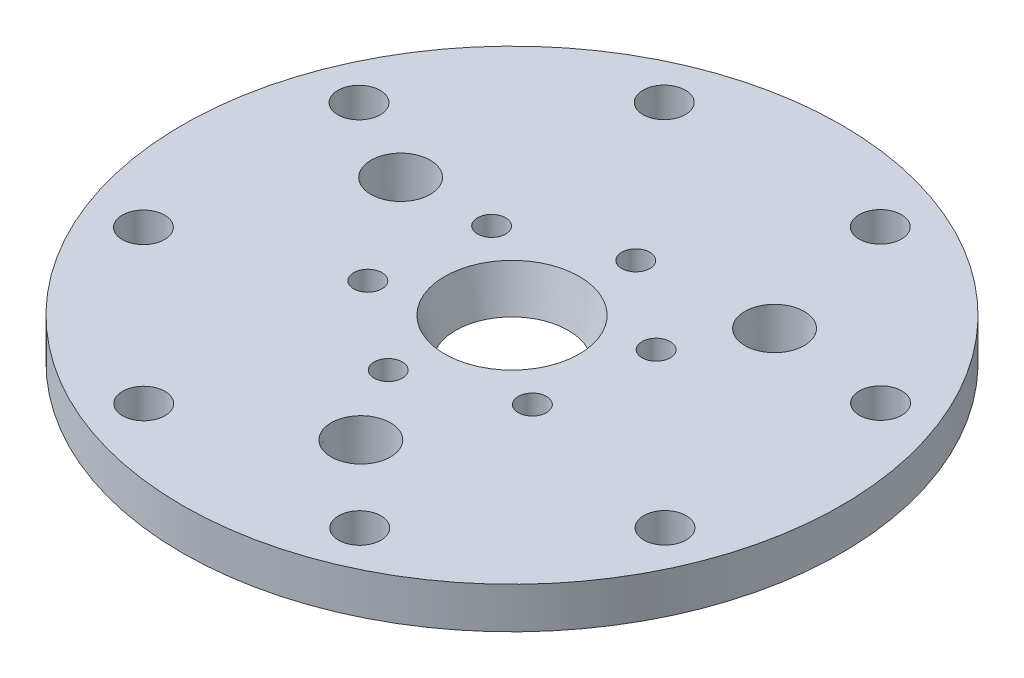
ISO-10303-21;
HEADER;
FILE_DESCRIPTION(('STEP AP214'),'2;1');
FILE_NAME('part.step','',(''),(''),'','','');
FILE_SCHEMA(('AUTOMOTIVE_DESIGN { 1 0 10303 214 1 1 1 1 }'));
ENDSEC;
DATA;
#1=APPLICATION_CONTEXT('core data for automotive mechanical design processes');
#2=APPLICATION_PROTOCOL_DEFINITION('international standard','automotive_design',2000,#1);
#3=PRODUCT_CONTEXT('',#1,'mechanical');
#4=PRODUCT('Part','Part','',(#3));
#5=PRODUCT_RELATED_PRODUCT_CATEGORY('part','',(#4));
#6=PRODUCT_DEFINITION_FORMATION('','',#4);
#7=PRODUCT_DEFINITION_CONTEXT('part definition',#1,'design');
#8=PRODUCT_DEFINITION('design','',#6,#7);
#9=PRODUCT_DEFINITION_SHAPE('','',#8);
#10=(LENGTH_UNIT() NAMED_UNIT(*) SI_UNIT(.MILLI.,.METRE.));
#11=(NAMED_UNIT(*) PLANE_ANGLE_UNIT() SI_UNIT($,.RADIAN.));
#12=(NAMED_UNIT(*) SI_UNIT($,.STERADIAN.) SOLID_ANGLE_UNIT());
#13=UNCERTAINTY_MEASURE_WITH_UNIT(LENGTH_MEASURE(1.E-05),#10,'distance_accuracy_value','');
#14=(GEOMETRIC_REPRESENTATION_CONTEXT(3) GLOBAL_UNCERTAINTY_ASSIGNED_CONTEXT((#13)) GLOBAL_UNIT_ASSIGNED_CONTEXT((#10,
#11,#12)) REPRESENTATION_CONTEXT('',''));
#15=CARTESIAN_POINT('',(0.,0.,0.));
#16=DIRECTION('',(0.,0.,1.));
#17=DIRECTION('',(1.,0.,0.));
#18=AXIS2_PLACEMENT_3D('',#15,#16,#17);
#19=CARTESIAN_POINT('',(0.,0.,0.));
#20=DIRECTION('',(0.,1.,0.));
#21=DIRECTION('',(0.,0.,1.));
#22=AXIS2_PLACEMENT_3D('',#19,#20,#21);
#23=PLANE('',#22);
#24=CARTESIAN_POINT('',(3.3300494790141,0.,-25.2942370257992));
#25=DIRECTION('',(0.,1.,0.));
#26=DIRECTION('',(0.,0.,1.));
#27=AXIS2_PLACEMENT_3D('',#24,#25,#26);
#28=CIRCLE('',#27,3.2639);
#29=CARTESIAN_POINT('',(3.3300494790141,0.,-22.0303370257992));
#30=VERTEX_POINT('',#29);
#31=EDGE_CURVE('E144',#30,#30,#28,.T.);
#32=ORIENTED_EDGE('',*,*,#31,.T.);
#33=EDGE_LOOP('',(#32));
#34=FACE_BOUND('',#33,.T.);
#35=CARTESIAN_POINT('',(-20.2404270941802,0.,-15.531025957585));
#36=DIRECTION('',(0.,1.,0.));
#37=DIRECTION('',(0.,0.,1.));
#38=AXIS2_PLACEMENT_3D('',#35,#36,#37);
#39=CIRCLE('',#38,3.2639);
#40=CARTESIAN_POINT('',(-20.2404270941802,0.,-12.267125957585));
#41=VERTEX_POINT('',#40);
#42=EDGE_CURVE('E138',#41,#41,#39,.T.);
#43=ORIENTED_EDGE('',*,*,#42,.T.);
#44=EDGE_LOOP('',(#43));
#45=FACE_BOUND('',#44,.T.);
#46=CARTESIAN_POINT('',(20.24042709418,0.,15.531025957585));
#47=DIRECTION('',(0.,1.,0.));
#48=DIRECTION('',(0.,0.,1.));
#49=AXIS2_PLACEMENT_3D('',#46,#47,#48);
#50=CIRCLE('',#49,3.2639);
#51=CARTESIAN_POINT('',(20.24042709418,0.,18.794925957585));
#52=VERTEX_POINT('',#51);
#53=EDGE_CURVE('E132',#52,#52,#50,.T.);
#54=ORIENTED_EDGE('',*,*,#53,.T.);
#55=EDGE_LOOP('',(#54));
#56=FACE_BOUND('',#55,.T.);
#57=CARTESIAN_POINT('',(-23.5704765731943,0.,9.76321106821453));
#58=DIRECTION('',(0.,1.,0.));
#59=DIRECTION('',(0.,0.,1.));
#60=AXIS2_PLACEMENT_3D('',#57,#58,#59);
#61=CIRCLE('',#60,3.2639);
#62=CARTESIAN_POINT('',(-23.5704765731943,0.,13.0271110682145));
#63=VERTEX_POINT('',#62);
#64=EDGE_CURVE('E126',#63,#63,#61,.T.);
#65=ORIENTED_EDGE('',*,*,#64,.T.);
#66=EDGE_LOOP('',(#65));
#67=FACE_BOUND('',#66,.T.);
#68=CARTESIAN_POINT('',(-3.33004947901425,0.,25.2942370257994));
#69=DIRECTION('',(0.,1.,0.));
#70=DIRECTION('',(0.,0.,1.));
#71=AXIS2_PLACEMENT_3D('',#68,#69,#70);
#72=CIRCLE('',#71,3.2639);
#73=CARTESIAN_POINT('',(-3.33004947901425,0.,28.5581370257994));
#74=VERTEX_POINT('',#73);
#75=EDGE_CURVE('E120',#74,#74,#72,.T.);
#76=ORIENTED_EDGE('',*,*,#75,.T.);
#77=EDGE_LOOP('',(#76));
#78=FACE_BOUND('',#77,.T.);
#79=CARTESIAN_POINT('',(23.570476573194,0.,-9.76321106821436));
#80=DIRECTION('',(0.,1.,0.));
#81=DIRECTION('',(0.,0.,1.));
#82=AXIS2_PLACEMENT_3D('',#79,#80,#81);
#83=CIRCLE('',#82,3.2639);
#84=CARTESIAN_POINT('',(23.570476573194,0.,-6.49931106821436));
#85=VERTEX_POINT('',#84);
#86=EDGE_CURVE('E114',#85,#85,#83,.T.);
#87=ORIENTED_EDGE('',*,*,#86,.T.);
#88=EDGE_LOOP('',(#87));
#89=FACE_BOUND('',#88,.T.);
#90=CARTESIAN_POINT('',(60.2072176605376,0.,-25.0136043709744));
#91=DIRECTION('',(0.,1.,0.));
#92=DIRECTION('',(0.,0.,1.));
#93=AXIS2_PLACEMENT_3D('',#90,#91,#92);
#94=CIRCLE('',#93,4.9022);
#95=CARTESIAN_POINT('',(60.2072176605376,0.,-20.1114043709744));
#96=VERTEX_POINT('',#95);
#97=EDGE_CURVE('E108',#96,#96,#94,.T.);
#98=ORIENTED_EDGE('',*,*,#97,.T.);
#99=EDGE_LOOP('',(#98));
#100=FACE_BOUND('',#99,.T.);
#101=CARTESIAN_POINT('',(60.2573748005619,0.,24.8884947052938));
#102=DIRECTION('',(0.,1.,0.));
#103=DIRECTION('',(0.,0.,1.));
#104=AXIS2_PLACEMENT_3D('',#101,#102,#103);
#105=CIRCLE('',#104,4.9022);
#106=CARTESIAN_POINT('',(60.2573748005619,0.,29.7906947052938));
#107=VERTEX_POINT('',#106);
#108=EDGE_CURVE('E102',#107,#107,#105,.T.);
#109=ORIENTED_EDGE('',*,*,#108,.T.);
#110=EDGE_LOOP('',(#109));
#111=FACE_BOUND('',#110,.T.);
#112=CARTESIAN_POINT('',(24.8856385511014,0.,-60.2642505633118));
#113=DIRECTION('',(0.,1.,0.));
#114=DIRECTION('',(0.,0.,1.));
#115=AXIS2_PLACEMENT_3D('',#112,#113,#114);
#116=CIRCLE('',#115,4.9022);
#117=CARTESIAN_POINT('',(24.8856385511014,0.,-55.3620505633118));
#118=VERTEX_POINT('',#117);
#119=EDGE_CURVE('E96',#118,#118,#116,.T.);
#120=ORIENTED_EDGE('',*,*,#119,.T.);
#121=EDGE_LOOP('',(#120));
#122=FACE_BOUND('',#121,.T.);
#123=CARTESIAN_POINT('',(-25.0164605137829,0.,-60.2140934213461));
#124=DIRECTION('',(0.,1.,0.));
#125=DIRECTION('',(0.,0.,1.));
#126=AXIS2_PLACEMENT_3D('',#123,#124,#125);
#127=CIRCLE('',#126,4.9022);
#128=CARTESIAN_POINT('',(-25.0164605137829,0.,-55.3118934213461));
#129=VERTEX_POINT('',#128);
#130=EDGE_CURVE('E90',#129,#129,#127,.T.);
#131=ORIENTED_EDGE('',*,*,#130,.T.);
#132=EDGE_LOOP('',(#131));
#133=FACE_BOUND('',#132,.T.);
#134=CARTESIAN_POINT('',(-60.2671066994754,0.,-24.8925143346813));
#135=DIRECTION('',(0.,1.,0.));
#136=DIRECTION('',(0.,0.,1.));
#137=AXIS2_PLACEMENT_3D('',#134,#135,#136);
#138=CIRCLE('',#137,4.9022);
#139=CARTESIAN_POINT('',(-60.2671066994754,0.,-19.9903143346813));
#140=VERTEX_POINT('',#139);
#141=EDGE_CURVE('E84',#140,#140,#138,.T.);
#142=ORIENTED_EDGE('',*,*,#141,.T.);
#143=EDGE_LOOP('',(#142));
#144=FACE_BOUND('',#143,.T.);
#145=CARTESIAN_POINT('',(-60.2169495689037,0.,25.0095847188311));
#146=DIRECTION('',(0.,1.,0.));
#147=DIRECTION('',(0.,0.,1.));
#148=AXIS2_PLACEMENT_3D('',#145,#146,#147);
#149=CIRCLE('',#148,4.9022);
#150=CARTESIAN_POINT('',(-60.2169495689037,0.,29.9117847188311));
#151=VERTEX_POINT('',#150);
#152=EDGE_CURVE('E78',#151,#151,#149,.T.);
#153=ORIENTED_EDGE('',*,*,#152,.T.);
#154=EDGE_LOOP('',(#153));
#155=FACE_BOUND('',#154,.T.);
#156=CARTESIAN_POINT('',(-24.8953704822231,0.,60.2602309206212));
#157=DIRECTION('',(0.,1.,0.));
#158=DIRECTION('',(0.,0.,1.));
#159=AXIS2_PLACEMENT_3D('',#156,#157,#158);
#160=CIRCLE('',#159,4.9022);
#161=CARTESIAN_POINT('',(-24.8953704822231,0.,65.1624309206212));
#162=VERTEX_POINT('',#161);
#163=EDGE_CURVE('E72',#162,#162,#160,.T.);
#164=ORIENTED_EDGE('',*,*,#163,.T.);
#165=EDGE_LOOP('',(#164));
#166=FACE_BOUND('',#165,.T.);
#167=CARTESIAN_POINT('',(25.0067285921135,0.,60.2100738014111));
#168=DIRECTION('',(0.,1.,0.));
#169=DIRECTION('',(0.,0.,1.));
#170=AXIS2_PLACEMENT_3D('',#167,#168,#169);
#171=CIRCLE('',#170,4.9022);
#172=CARTESIAN_POINT('',(25.0067285921135,0.,65.1122738014111));
#173=VERTEX_POINT('',#172);
#174=EDGE_CURVE('E66',#173,#173,#171,.T.);
#175=ORIENTED_EDGE('',*,*,#174,.T.);
#176=EDGE_LOOP('',(#175));
#177=FACE_BOUND('',#176,.T.);
#178=CARTESIAN_POINT('',(7.48315115633477,0.,42.4390591063698));
#179=DIRECTION('',(0.,1.,0.));
#180=DIRECTION('',(0.,0.,1.));
#181=AXIS2_PLACEMENT_3D('',#178,#179,#180);
#182=CIRCLE('',#181,6.57280874440069);
#183=CARTESIAN_POINT('',(7.48315115633477,0.,49.0118678507704));
#184=VERTEX_POINT('',#183);
#185=EDGE_CURVE('E60',#184,#184,#182,.T.);
#186=ORIENTED_EDGE('',*,*,#185,.T.);
#187=EDGE_LOOP('',(#186));
#188=FACE_BOUND('',#187,.T.);
#189=CARTESIAN_POINT('',(-40.4948788769928,0.,-14.7389305514403));
#190=DIRECTION('',(0.,1.,0.));
#191=DIRECTION('',(0.,0.,1.));
#192=AXIS2_PLACEMENT_3D('',#189,#190,#191);
#193=CIRCLE('',#192,6.57280874440069);
#194=CARTESIAN_POINT('',(-40.4948788769928,0.,-8.16612180703957));
#195=VERTEX_POINT('',#194);
#196=EDGE_CURVE('E54',#195,#195,#193,.T.);
#197=ORIENTED_EDGE('',*,*,#196,.T.);
#198=EDGE_LOOP('',(#197));
#199=FACE_BOUND('',#198,.T.);
#200=CARTESIAN_POINT('',(33.0117277206584,0.,-27.7001285549294));
#201=DIRECTION('',(0.,1.,0.));
#202=DIRECTION('',(0.,0.,1.));
#203=AXIS2_PLACEMENT_3D('',#200,#201,#202);
#204=CIRCLE('',#203,6.57280874440069);
#205=CARTESIAN_POINT('',(33.0117277206584,0.,-21.1273198105287));
#206=VERTEX_POINT('',#205);
#207=EDGE_CURVE('E35',#206,#206,#204,.T.);
#208=ORIENTED_EDGE('',*,*,#207,.T.);
#209=EDGE_LOOP('',(#208));
#210=FACE_BOUND('',#209,.T.);
#211=CARTESIAN_POINT('',(0.,0.,0.));
#212=DIRECTION('',(0.,-1.,0.));
#213=DIRECTION('',(0.,0.,-1.));
#214=AXIS2_PLACEMENT_3D('',#211,#212,#213);
#215=CIRCLE('',#214,13.);
#216=CARTESIAN_POINT('',(0.,0.,-13.));
#217=VERTEX_POINT('',#216);
#218=EDGE_CURVE('E44',#217,#217,#215,.T.);
#219=ORIENTED_EDGE('',*,*,#218,.F.);
#220=EDGE_LOOP('',(#219));
#221=FACE_BOUND('',#220,.T.);
#222=CARTESIAN_POINT('',(0.,0.,0.));
#223=DIRECTION('',(0.,1.,0.));
#224=DIRECTION('',(0.,0.,1.));
#225=AXIS2_PLACEMENT_3D('',#222,#223,#224);
#226=CIRCLE('',#225,76.2);
#227=CARTESIAN_POINT('',(0.,0.,-76.2));
#228=VERTEX_POINT('',#227);
#229=EDGE_CURVE('E39',#228,#228,#226,.T.);
#230=ORIENTED_EDGE('',*,*,#229,.F.);
#231=EDGE_LOOP('',(#230));
#232=FACE_BOUND('',#231,.T.);
#233=ADVANCED_FACE('F31',(#34,#45,#56,#67,#78,#89,#100,#111,#122,#133,#144,#155,#166,#177,#188,
#199,#210,#221,#232),#23,.F.);
#234=CARTESIAN_POINT('',(0.,9.525,0.));
#235=DIRECTION('',(0.,-1.,0.));
#236=DIRECTION('',(0.,0.,-1.));
#237=AXIS2_PLACEMENT_3D('',#234,#235,#236);
#238=CYLINDRICAL_SURFACE('',#237,76.2);
#239=CARTESIAN_POINT('',(0.,9.525,0.));
#240=DIRECTION('',(0.,1.,0.));
#241=DIRECTION('',(0.,0.,1.));
#242=AXIS2_PLACEMENT_3D('',#239,#240,#241);
#243=CIRCLE('',#242,76.2);
#244=CARTESIAN_POINT('',(0.,9.525,-76.2));
#245=VERTEX_POINT('',#244);
#246=EDGE_CURVE('E10',#245,#245,#243,.T.);
#247=CARTESIAN_POINT('',(0.,9.525,-76.2));
#248=CARTESIAN_POINT('',(0.,9.42578125,-76.2));
#249=CARTESIAN_POINT('',(0.,9.3265625,-76.2));
#250=CARTESIAN_POINT('',(0.,9.128125,-76.2));
#251=CARTESIAN_POINT('',(0.,9.02890625,-76.2));
#252=CARTESIAN_POINT('',(0.,8.83046875,-76.2));
#253=CARTESIAN_POINT('',(0.,8.73125,-76.2));
#254=CARTESIAN_POINT('',(0.,8.5328125,-76.2));
#255=CARTESIAN_POINT('',(0.,8.43359375,-76.2));
#256=CARTESIAN_POINT('',(0.,8.23515625,-76.2));
#257=CARTESIAN_POINT('',(0.,8.1359375,-76.2));
#258=CARTESIAN_POINT('',(0.,7.9375,-76.2));
#259=CARTESIAN_POINT('',(0.,7.83828125,-76.2));
#260=CARTESIAN_POINT('',(0.,7.63984375,-76.2));
#261=CARTESIAN_POINT('',(0.,7.540625,-76.2));
#262=CARTESIAN_POINT('',(0.,7.3421875,-76.2));
#263=CARTESIAN_POINT('',(0.,7.24296875,-76.2));
#264=CARTESIAN_POINT('',(0.,7.04453125,-76.2));
#265=CARTESIAN_POINT('',(0.,6.9453125,-76.2));
#266=CARTESIAN_POINT('',(0.,6.746875,-76.2));
#267=CARTESIAN_POINT('',(0.,6.64765625,-76.2));
#268=CARTESIAN_POINT('',(0.,6.44921875,-76.2));
#269=CARTESIAN_POINT('',(0.,6.35,-76.2));
#270=CARTESIAN_POINT('',(0.,6.1515625,-76.2));
#271=CARTESIAN_POINT('',(0.,6.05234375,-76.2));
#272=CARTESIAN_POINT('',(0.,5.85390625,-76.2));
#273=CARTESIAN_POINT('',(0.,5.7546875,-76.2));
#274=CARTESIAN_POINT('',(0.,5.55625,-76.2));
#275=CARTESIAN_POINT('',(0.,5.45703125,-76.2));
#276=CARTESIAN_POINT('',(0.,5.25859375,-76.2));
#277=CARTESIAN_POINT('',(0.,5.159375,-76.2));
#278=CARTESIAN_POINT('',(0.,4.9609375,-76.2));
#279=CARTESIAN_POINT('',(0.,4.86171875,-76.2));
#280=CARTESIAN_POINT('',(0.,4.66328125,-76.2));
#281=CARTESIAN_POINT('',(0.,4.5640625,-76.2));
#282=CARTESIAN_POINT('',(0.,4.365625,-76.2));
#283=CARTESIAN_POINT('',(0.,4.26640625,-76.2));
#284=CARTESIAN_POINT('',(0.,4.06796875,-76.2));
#285=CARTESIAN_POINT('',(0.,3.96875,-76.2));
#286=CARTESIAN_POINT('',(0.,3.7703125,-76.2));
#287=CARTESIAN_POINT('',(0.,3.67109375,-76.2));
#288=CARTESIAN_POINT('',(0.,3.47265625,-76.2));
#289=CARTESIAN_POINT('',(0.,3.3734375,-76.2));
#290=CARTESIAN_POINT('',(0.,3.175,-76.2));
#291=CARTESIAN_POINT('',(0.,3.07578125,-76.2));
#292=CARTESIAN_POINT('',(0.,2.87734375,-76.2));
#293=CARTESIAN_POINT('',(0.,2.778125,-76.2));
#294=CARTESIAN_POINT('',(0.,2.5796875,-76.2));
#295=CARTESIAN_POINT('',(0.,2.48046875,-76.2));
#296=CARTESIAN_POINT('',(0.,2.28203125,-76.2));
#297=CARTESIAN_POINT('',(0.,2.1828125,-76.2));
#298=CARTESIAN_POINT('',(0.,1.984375,-76.2));
#299=CARTESIAN_POINT('',(0.,1.88515625,-76.2));
#300=CARTESIAN_POINT('',(0.,1.68671875,-76.2));
#301=CARTESIAN_POINT('',(0.,1.5875,-76.2));
#302=CARTESIAN_POINT('',(0.,1.3890625,-76.2));
#303=CARTESIAN_POINT('',(0.,1.28984375,-76.2));
#304=CARTESIAN_POINT('',(0.,1.09140625,-76.2));
#305=CARTESIAN_POINT('',(0.,0.992187500000001,-76.2));
#306=CARTESIAN_POINT('',(0.,0.793750000000001,-76.2));
#307=CARTESIAN_POINT('',(0.,0.69453125,-76.2));
#308=CARTESIAN_POINT('',(0.,0.49609375,-76.2));
#309=CARTESIAN_POINT('',(0.,0.396875,-76.2));
#310=CARTESIAN_POINT('',(0.,0.1984375,-76.2));
#311=CARTESIAN_POINT('',(0.,0.0992187500000001,-76.2));
#312=CARTESIAN_POINT('',(0.,0.,-76.2));
#313=B_SPLINE_CURVE_WITH_KNOTS('',3,(#247,#248,#249,#250,#251,#252,#253,#254,#255,#256,#257,
#258,#259,#260,#261,#262,#263,#264,#265,#266,#267,#268,#269,#270,#271,#272,#273,#274,#275,#276,
#277,#278,#279,#280,#281,#282,#283,#284,#285,#286,#287,#288,#289,#290,#291,#292,#293,#294,#295,
#296,#297,#298,#299,#300,#301,#302,#303,#304,#305,#306,#307,#308,#309,#310,#311,#312),
.UNSPECIFIED.,.F.,.F.,(4,2,2,2,2,2,2,2,2,2,2,2,2,2,2,2,2,2,2,2,2,2,2,2,2,2,2,2,2,2,2,2,4),(0.,
0.29765625,0.5953125,0.892968750000001,1.190625,1.48828125,1.7859375,2.08359375,2.38125,
2.67890625,2.9765625,3.27421875,3.571875,3.86953125,4.1671875,4.46484375,4.7625,5.06015625,
5.3578125,5.65546875,5.953125,6.25078125,6.5484375,6.84609375,7.14375,7.44140625,7.7390625,
8.03671875,8.334375,8.63203125,8.9296875,9.22734375,9.525),.UNSPECIFIED.);
#314=EDGE_CURVE('BSEAM33',#245,#228,#313,.T.);
#315=ORIENTED_EDGE('',*,*,#246,.F.);
#316=ORIENTED_EDGE('',*,*,#229,.T.);
#317=ORIENTED_EDGE('',*,*,#314,.T.);
#318=ORIENTED_EDGE('',*,*,#314,.F.);
#319=EDGE_LOOP('',(#315,#317,#316,#318));
#320=FACE_BOUND('',#319,.T.);
#321=ADVANCED_FACE('F33',(#320),#238,.T.);
#322=CARTESIAN_POINT('',(0.,9.525,0.));
#323=DIRECTION('',(0.,1.,0.));
#324=DIRECTION('',(0.,0.,1.));
#325=AXIS2_PLACEMENT_3D('',#322,#323,#324);
#326=PLANE('',#325);
#327=CARTESIAN_POINT('',(3.3300494790141,9.525,-25.2942370257992));
#328=DIRECTION('',(0.,1.,0.));
#329=DIRECTION('',(0.,0.,1.));
#330=AXIS2_PLACEMENT_3D('',#327,#328,#329);
#331=CIRCLE('',#330,3.2639);
#332=CARTESIAN_POINT('',(3.3300494790141,9.525,-22.0303370257992));
#333=VERTEX_POINT('',#332);
#334=EDGE_CURVE('E147',#333,#333,#331,.T.);
#335=ORIENTED_EDGE('',*,*,#334,.F.);
#336=EDGE_LOOP('',(#335));
#337=FACE_BOUND('',#336,.T.);
#338=CARTESIAN_POINT('',(-20.2404270941802,9.525,-15.531025957585));
#339=DIRECTION('',(0.,1.,0.));
#340=DIRECTION('',(0.,0.,1.));
#341=AXIS2_PLACEMENT_3D('',#338,#339,#340);
#342=CIRCLE('',#341,3.2639);
#343=CARTESIAN_POINT('',(-20.2404270941802,9.525,-12.267125957585));
#344=VERTEX_POINT('',#343);
#345=EDGE_CURVE('E141',#344,#344,#342,.T.);
#346=ORIENTED_EDGE('',*,*,#345,.F.);
#347=EDGE_LOOP('',(#346));
#348=FACE_BOUND('',#347,.T.);
#349=CARTESIAN_POINT('',(20.24042709418,9.525,15.531025957585));
#350=DIRECTION('',(0.,1.,0.));
#351=DIRECTION('',(0.,0.,1.));
#352=AXIS2_PLACEMENT_3D('',#349,#350,#351);
#353=CIRCLE('',#352,3.2639);
#354=CARTESIAN_POINT('',(20.24042709418,9.525,18.794925957585));
#355=VERTEX_POINT('',#354);
#356=EDGE_CURVE('E135',#355,#355,#353,.T.);
#357=ORIENTED_EDGE('',*,*,#356,.F.);
#358=EDGE_LOOP('',(#357));
#359=FACE_BOUND('',#358,.T.);
#360=CARTESIAN_POINT('',(-23.5704765731943,9.525,9.76321106821453));
#361=DIRECTION('',(0.,1.,0.));
#362=DIRECTION('',(0.,0.,1.));
#363=AXIS2_PLACEMENT_3D('',#360,#361,#362);
#364=CIRCLE('',#363,3.2639);
#365=CARTESIAN_POINT('',(-23.5704765731943,9.525,13.0271110682145));
#366=VERTEX_POINT('',#365);
#367=EDGE_CURVE('E129',#366,#366,#364,.T.);
#368=ORIENTED_EDGE('',*,*,#367,.F.);
#369=EDGE_LOOP('',(#368));
#370=FACE_BOUND('',#369,.T.);
#371=CARTESIAN_POINT('',(-3.33004947901425,9.525,25.2942370257994));
#372=DIRECTION('',(0.,1.,0.));
#373=DIRECTION('',(0.,0.,1.));
#374=AXIS2_PLACEMENT_3D('',#371,#372,#373);
#375=CIRCLE('',#374,3.2639);
#376=CARTESIAN_POINT('',(-3.33004947901425,9.525,28.5581370257994));
#377=VERTEX_POINT('',#376);
#378=EDGE_CURVE('E123',#377,#377,#375,.T.);
#379=ORIENTED_EDGE('',*,*,#378,.F.);
#380=EDGE_LOOP('',(#379));
#381=FACE_BOUND('',#380,.T.);
#382=CARTESIAN_POINT('',(23.570476573194,9.525,-9.76321106821436));
#383=DIRECTION('',(0.,1.,0.));
#384=DIRECTION('',(0.,0.,1.));
#385=AXIS2_PLACEMENT_3D('',#382,#383,#384);
#386=CIRCLE('',#385,3.2639);
#387=CARTESIAN_POINT('',(23.570476573194,9.525,-6.49931106821437));
#388=VERTEX_POINT('',#387);
#389=EDGE_CURVE('E117',#388,#388,#386,.T.);
#390=ORIENTED_EDGE('',*,*,#389,.F.);
#391=EDGE_LOOP('',(#390));
#392=FACE_BOUND('',#391,.T.);
#393=CARTESIAN_POINT('',(60.2072176605376,9.525,-25.0136043709744));
#394=DIRECTION('',(0.,1.,0.));
#395=DIRECTION('',(0.,0.,1.));
#396=AXIS2_PLACEMENT_3D('',#393,#394,#395);
#397=CIRCLE('',#396,4.9022);
#398=CARTESIAN_POINT('',(60.2072176605376,9.525,-20.1114043709744));
#399=VERTEX_POINT('',#398);
#400=EDGE_CURVE('E111',#399,#399,#397,.T.);
#401=ORIENTED_EDGE('',*,*,#400,.F.);
#402=EDGE_LOOP('',(#401));
#403=FACE_BOUND('',#402,.T.);
#404=CARTESIAN_POINT('',(60.2573748005619,9.525,24.8884947052938));
#405=DIRECTION('',(0.,1.,0.));
#406=DIRECTION('',(0.,0.,1.));
#407=AXIS2_PLACEMENT_3D('',#404,#405,#406);
#408=CIRCLE('',#407,4.9022);
#409=CARTESIAN_POINT('',(60.2573748005619,9.525,29.7906947052938));
#410=VERTEX_POINT('',#409);
#411=EDGE_CURVE('E105',#410,#410,#408,.T.);
#412=ORIENTED_EDGE('',*,*,#411,.F.);
#413=EDGE_LOOP('',(#412));
#414=FACE_BOUND('',#413,.T.);
#415=CARTESIAN_POINT('',(24.8856385511014,9.525,-60.2642505633118));
#416=DIRECTION('',(0.,1.,0.));
#417=DIRECTION('',(0.,0.,1.));
#418=AXIS2_PLACEMENT_3D('',#415,#416,#417);
#419=CIRCLE('',#418,4.9022);
#420=CARTESIAN_POINT('',(24.8856385511014,9.525,-55.3620505633118));
#421=VERTEX_POINT('',#420);
#422=EDGE_CURVE('E99',#421,#421,#419,.T.);
#423=ORIENTED_EDGE('',*,*,#422,.F.);
#424=EDGE_LOOP('',(#423));
#425=FACE_BOUND('',#424,.T.);
#426=CARTESIAN_POINT('',(-25.0164605137829,9.525,-60.2140934213461));
#427=DIRECTION('',(0.,1.,0.));
#428=DIRECTION('',(0.,0.,1.));
#429=AXIS2_PLACEMENT_3D('',#426,#427,#428);
#430=CIRCLE('',#429,4.9022);
#431=CARTESIAN_POINT('',(-25.0164605137829,9.525,-55.3118934213461));
#432=VERTEX_POINT('',#431);
#433=EDGE_CURVE('E93',#432,#432,#430,.T.);
#434=ORIENTED_EDGE('',*,*,#433,.F.);
#435=EDGE_LOOP('',(#434));
#436=FACE_BOUND('',#435,.T.);
#437=CARTESIAN_POINT('',(-60.2671066994754,9.525,-24.8925143346813));
#438=DIRECTION('',(0.,1.,0.));
#439=DIRECTION('',(0.,0.,1.));
#440=AXIS2_PLACEMENT_3D('',#437,#438,#439);
#441=CIRCLE('',#440,4.9022);
#442=CARTESIAN_POINT('',(-60.2671066994754,9.525,-19.9903143346813));
#443=VERTEX_POINT('',#442);
#444=EDGE_CURVE('E87',#443,#443,#441,.T.);
#445=ORIENTED_EDGE('',*,*,#444,.F.);
#446=EDGE_LOOP('',(#445));
#447=FACE_BOUND('',#446,.T.);
#448=CARTESIAN_POINT('',(-60.2169495689037,9.525,25.0095847188311));
#449=DIRECTION('',(0.,1.,0.));
#450=DIRECTION('',(0.,0.,1.));
#451=AXIS2_PLACEMENT_3D('',#448,#449,#450);
#452=CIRCLE('',#451,4.9022);
#453=CARTESIAN_POINT('',(-60.2169495689037,9.525,29.9117847188311));
#454=VERTEX_POINT('',#453);
#455=EDGE_CURVE('E81',#454,#454,#452,.T.);
#456=ORIENTED_EDGE('',*,*,#455,.F.);
#457=EDGE_LOOP('',(#456));
#458=FACE_BOUND('',#457,.T.);
#459=CARTESIAN_POINT('',(-24.8953704822231,9.525,60.2602309206212));
#460=DIRECTION('',(0.,1.,0.));
#461=DIRECTION('',(0.,0.,1.));
#462=AXIS2_PLACEMENT_3D('',#459,#460,#461);
#463=CIRCLE('',#462,4.9022);
#464=CARTESIAN_POINT('',(-24.8953704822231,9.525,65.1624309206212));
#465=VERTEX_POINT('',#464);
#466=EDGE_CURVE('E75',#465,#465,#463,.T.);
#467=ORIENTED_EDGE('',*,*,#466,.F.);
#468=EDGE_LOOP('',(#467));
#469=FACE_BOUND('',#468,.T.);
#470=CARTESIAN_POINT('',(25.0067285921135,9.525,60.2100738014111));
#471=DIRECTION('',(0.,1.,0.));
#472=DIRECTION('',(0.,0.,1.));
#473=AXIS2_PLACEMENT_3D('',#470,#471,#472);
#474=CIRCLE('',#473,4.9022);
#475=CARTESIAN_POINT('',(25.0067285921135,9.525,65.1122738014111));
#476=VERTEX_POINT('',#475);
#477=EDGE_CURVE('E69',#476,#476,#474,.T.);
#478=ORIENTED_EDGE('',*,*,#477,.F.);
#479=EDGE_LOOP('',(#478));
#480=FACE_BOUND('',#479,.T.);
#481=CARTESIAN_POINT('',(7.48315115633477,9.525,42.4390591063698));
#482=DIRECTION('',(0.,1.,0.));
#483=DIRECTION('',(0.,0.,1.));
#484=AXIS2_PLACEMENT_3D('',#481,#482,#483);
#485=CIRCLE('',#484,6.858);
#486=CARTESIAN_POINT('',(7.48315115633477,9.525,49.2970591063698));
#487=VERTEX_POINT('',#486);
#488=EDGE_CURVE('E63',#487,#487,#485,.T.);
#489=ORIENTED_EDGE('',*,*,#488,.F.);
#490=EDGE_LOOP('',(#489));
#491=FACE_BOUND('',#490,.T.);
#492=CARTESIAN_POINT('',(-40.4948788769928,9.525,-14.7389305514403));
#493=DIRECTION('',(0.,1.,0.));
#494=DIRECTION('',(0.,0.,1.));
#495=AXIS2_PLACEMENT_3D('',#492,#493,#494);
#496=CIRCLE('',#495,6.858);
#497=CARTESIAN_POINT('',(-40.4948788769928,9.525,-7.88093055144026));
#498=VERTEX_POINT('',#497);
#499=EDGE_CURVE('E57',#498,#498,#496,.T.);
#500=ORIENTED_EDGE('',*,*,#499,.F.);
#501=EDGE_LOOP('',(#500));
#502=FACE_BOUND('',#501,.T.);
#503=CARTESIAN_POINT('',(33.0117277206584,9.525,-27.7001285549294));
#504=DIRECTION('',(0.,1.,0.));
#505=DIRECTION('',(0.,0.,1.));
#506=AXIS2_PLACEMENT_3D('',#503,#504,#505);
#507=CIRCLE('',#506,6.858);
#508=CARTESIAN_POINT('',(33.0117277206584,9.525,-20.8421285549294));
#509=VERTEX_POINT('',#508);
#510=EDGE_CURVE('E51',#509,#509,#507,.T.);
#511=ORIENTED_EDGE('',*,*,#510,.F.);
#512=EDGE_LOOP('',(#511));
#513=FACE_BOUND('',#512,.T.);
#514=CARTESIAN_POINT('',(0.,9.525,0.));
#515=DIRECTION('',(0.,-1.,0.));
#516=DIRECTION('',(0.,0.,-1.));
#517=AXIS2_PLACEMENT_3D('',#514,#515,#516);
#518=CIRCLE('',#517,15.5522160579064);
#519=CARTESIAN_POINT('',(0.,9.525,-15.5522160579064));
#520=VERTEX_POINT('',#519);
#521=EDGE_CURVE('E48',#520,#520,#518,.T.);
#522=ORIENTED_EDGE('',*,*,#521,.T.);
#523=EDGE_LOOP('',(#522));
#524=FACE_BOUND('',#523,.T.);
#525=ORIENTED_EDGE('',*,*,#246,.T.);
#526=EDGE_LOOP('',(#525));
#527=FACE_BOUND('',#526,.T.);
#528=ADVANCED_FACE('F153',(#337,#348,#359,#370,#381,#392,#403,#414,#425,#436,#447,#458,#469,
#480,#491,#502,#513,#524,#527),#326,.T.);
#529=CARTESIAN_POINT('',(0.,0.,0.));
#530=DIRECTION('',(0.,1.,0.));
#531=DIRECTION('',(0.,0.,1.));
#532=AXIS2_PLACEMENT_3D('',#529,#530,#531);
#533=CONICAL_SURFACE('',#532,13.,0.261799387799149);
#534=ORIENTED_EDGE('',*,*,#521,.F.);
#535=EDGE_LOOP('',(#534));
#536=FACE_BOUND('',#535,.T.);
#537=ORIENTED_EDGE('',*,*,#218,.T.);
#538=EDGE_LOOP('',(#537));
#539=FACE_BOUND('',#538,.T.);
#540=ADVANCED_FACE('F156',(#536,#539),#533,.F.);
#541=CARTESIAN_POINT('',(33.0117277206584,9.525,-27.7001285549294));
#542=DIRECTION('',(0.,1.,0.));
#543=DIRECTION('',(0.,0.,1.));
#544=AXIS2_PLACEMENT_3D('',#541,#542,#543);
#545=CONICAL_SURFACE('',#544,6.858,0.0299323966717029);
#546=ORIENTED_EDGE('',*,*,#510,.T.);
#547=EDGE_LOOP('',(#546));
#548=FACE_BOUND('',#547,.T.);
#549=ORIENTED_EDGE('',*,*,#207,.F.);
#550=EDGE_LOOP('',(#549));
#551=FACE_BOUND('',#550,.T.);
#552=ADVANCED_FACE('F194',(#548,#551),#545,.F.);
#553=CARTESIAN_POINT('',(-40.4948788769928,9.525,-14.7389305514403));
#554=DIRECTION('',(0.,1.,0.));
#555=DIRECTION('',(0.,0.,1.));
#556=AXIS2_PLACEMENT_3D('',#553,#554,#555);
#557=CONICAL_SURFACE('',#556,6.858,0.0299323966717029);
#558=ORIENTED_EDGE('',*,*,#499,.T.);
#559=EDGE_LOOP('',(#558));
#560=FACE_BOUND('',#559,.T.);
#561=ORIENTED_EDGE('',*,*,#196,.F.);
#562=EDGE_LOOP('',(#561));
#563=FACE_BOUND('',#562,.T.);
#564=ADVANCED_FACE('F224',(#560,#563),#557,.F.);
#565=CARTESIAN_POINT('',(7.48315115633477,9.525,42.4390591063698));
#566=DIRECTION('',(0.,1.,0.));
#567=DIRECTION('',(0.,0.,1.));
#568=AXIS2_PLACEMENT_3D('',#565,#566,#567);
#569=CONICAL_SURFACE('',#568,6.858,0.0299323966717028);
#570=ORIENTED_EDGE('',*,*,#488,.T.);
#571=EDGE_LOOP('',(#570));
#572=FACE_BOUND('',#571,.T.);
#573=ORIENTED_EDGE('',*,*,#185,.F.);
#574=EDGE_LOOP('',(#573));
#575=FACE_BOUND('',#574,.T.);
#576=ADVANCED_FACE('F232',(#572,#575),#569,.F.);
#577=CARTESIAN_POINT('',(25.0067285921135,9.525,60.2100738014111));
#578=DIRECTION('',(0.,1.,0.));
#579=DIRECTION('',(0.,0.,1.));
#580=AXIS2_PLACEMENT_3D('',#577,#578,#579);
#581=CYLINDRICAL_SURFACE('',#580,4.9022);
#582=ORIENTED_EDGE('',*,*,#174,.F.);
#583=EDGE_LOOP('',(#582));
#584=FACE_BOUND('',#583,.T.);
#585=ORIENTED_EDGE('',*,*,#477,.T.);
#586=EDGE_LOOP('',(#585));
#587=FACE_BOUND('',#586,.T.);
#588=ADVANCED_FACE('F240',(#584,#587),#581,.F.);
#589=CARTESIAN_POINT('',(-24.8953704822231,9.525,60.2602309206212));
#590=DIRECTION('',(0.,1.,0.));
#591=DIRECTION('',(0.,0.,1.));
#592=AXIS2_PLACEMENT_3D('',#589,#590,#591);
#593=CYLINDRICAL_SURFACE('',#592,4.9022);
#594=ORIENTED_EDGE('',*,*,#163,.F.);
#595=EDGE_LOOP('',(#594));
#596=FACE_BOUND('',#595,.T.);
#597=ORIENTED_EDGE('',*,*,#466,.T.);
#598=EDGE_LOOP('',(#597));
#599=FACE_BOUND('',#598,.T.);
#600=ADVANCED_FACE('F248',(#596,#599),#593,.F.);
#601=CARTESIAN_POINT('',(-60.2169495689037,9.525,25.0095847188311));
#602=DIRECTION('',(0.,1.,0.));
#603=DIRECTION('',(0.,0.,1.));
#604=AXIS2_PLACEMENT_3D('',#601,#602,#603);
#605=CYLINDRICAL_SURFACE('',#604,4.9022);
#606=ORIENTED_EDGE('',*,*,#152,.F.);
#607=EDGE_LOOP('',(#606));
#608=FACE_BOUND('',#607,.T.);
#609=ORIENTED_EDGE('',*,*,#455,.T.);
#610=EDGE_LOOP('',(#609));
#611=FACE_BOUND('',#610,.T.);
#612=ADVANCED_FACE('F256',(#608,#611),#605,.F.);
#613=CARTESIAN_POINT('',(-60.2671066994754,9.525,-24.8925143346813));
#614=DIRECTION('',(0.,1.,0.));
#615=DIRECTION('',(0.,0.,1.));
#616=AXIS2_PLACEMENT_3D('',#613,#614,#615);
#617=CYLINDRICAL_SURFACE('',#616,4.9022);
#618=ORIENTED_EDGE('',*,*,#141,.F.);
#619=EDGE_LOOP('',(#618));
#620=FACE_BOUND('',#619,.T.);
#621=ORIENTED_EDGE('',*,*,#444,.T.);
#622=EDGE_LOOP('',(#621));
#623=FACE_BOUND('',#622,.T.);
#624=ADVANCED_FACE('F264',(#620,#623),#617,.F.);
#625=CARTESIAN_POINT('',(-25.0164605137829,9.525,-60.2140934213461));
#626=DIRECTION('',(0.,1.,0.));
#627=DIRECTION('',(0.,0.,1.));
#628=AXIS2_PLACEMENT_3D('',#625,#626,#627);
#629=CYLINDRICAL_SURFACE('',#628,4.9022);
#630=ORIENTED_EDGE('',*,*,#130,.F.);
#631=EDGE_LOOP('',(#630));
#632=FACE_BOUND('',#631,.T.);
#633=ORIENTED_EDGE('',*,*,#433,.T.);
#634=EDGE_LOOP('',(#633));
#635=FACE_BOUND('',#634,.T.);
#636=ADVANCED_FACE('F272',(#632,#635),#629,.F.);
#637=CARTESIAN_POINT('',(24.8856385511014,9.525,-60.2642505633118));
#638=DIRECTION('',(0.,1.,0.));
#639=DIRECTION('',(0.,0.,1.));
#640=AXIS2_PLACEMENT_3D('',#637,#638,#639);
#641=CYLINDRICAL_SURFACE('',#640,4.9022);
#642=ORIENTED_EDGE('',*,*,#119,.F.);
#643=EDGE_LOOP('',(#642));
#644=FACE_BOUND('',#643,.T.);
#645=ORIENTED_EDGE('',*,*,#422,.T.);
#646=EDGE_LOOP('',(#645));
#647=FACE_BOUND('',#646,.T.);
#648=ADVANCED_FACE('F280',(#644,#647),#641,.F.);
#649=CARTESIAN_POINT('',(60.2573748005619,9.525,24.8884947052938));
#650=DIRECTION('',(0.,1.,0.));
#651=DIRECTION('',(0.,0.,1.));
#652=AXIS2_PLACEMENT_3D('',#649,#650,#651);
#653=CYLINDRICAL_SURFACE('',#652,4.9022);
#654=ORIENTED_EDGE('',*,*,#108,.F.);
#655=EDGE_LOOP('',(#654));
#656=FACE_BOUND('',#655,.T.);
#657=ORIENTED_EDGE('',*,*,#411,.T.);
#658=EDGE_LOOP('',(#657));
#659=FACE_BOUND('',#658,.T.);
#660=ADVANCED_FACE('F288',(#656,#659),#653,.F.);
#661=CARTESIAN_POINT('',(60.2072176605376,9.525,-25.0136043709744));
#662=DIRECTION('',(0.,1.,0.));
#663=DIRECTION('',(0.,0.,1.));
#664=AXIS2_PLACEMENT_3D('',#661,#662,#663);
#665=CYLINDRICAL_SURFACE('',#664,4.9022);
#666=ORIENTED_EDGE('',*,*,#97,.F.);
#667=EDGE_LOOP('',(#666));
#668=FACE_BOUND('',#667,.T.);
#669=ORIENTED_EDGE('',*,*,#400,.T.);
#670=EDGE_LOOP('',(#669));
#671=FACE_BOUND('',#670,.T.);
#672=ADVANCED_FACE('F296',(#668,#671),#665,.F.);
#673=CARTESIAN_POINT('',(23.570476573194,9.525,-9.76321106821436));
#674=DIRECTION('',(0.,1.,0.));
#675=DIRECTION('',(0.,0.,1.));
#676=AXIS2_PLACEMENT_3D('',#673,#674,#675);
#677=CYLINDRICAL_SURFACE('',#676,3.2639);
#678=ORIENTED_EDGE('',*,*,#86,.F.);
#679=EDGE_LOOP('',(#678));
#680=FACE_BOUND('',#679,.T.);
#681=ORIENTED_EDGE('',*,*,#389,.T.);
#682=EDGE_LOOP('',(#681));
#683=FACE_BOUND('',#682,.T.);
#684=ADVANCED_FACE('F304',(#680,#683),#677,.F.);
#685=CARTESIAN_POINT('',(-3.33004947901425,9.525,25.2942370257994));
#686=DIRECTION('',(0.,1.,0.));
#687=DIRECTION('',(0.,0.,1.));
#688=AXIS2_PLACEMENT_3D('',#685,#686,#687);
#689=CYLINDRICAL_SURFACE('',#688,3.2639);
#690=ORIENTED_EDGE('',*,*,#75,.F.);
#691=EDGE_LOOP('',(#690));
#692=FACE_BOUND('',#691,.T.);
#693=ORIENTED_EDGE('',*,*,#378,.T.);
#694=EDGE_LOOP('',(#693));
#695=FACE_BOUND('',#694,.T.);
#696=ADVANCED_FACE('F311',(#692,#695),#689,.F.);
#697=CARTESIAN_POINT('',(-23.5704765731943,9.525,9.76321106821453));
#698=DIRECTION('',(0.,1.,0.));
#699=DIRECTION('',(0.,0.,1.));
#700=AXIS2_PLACEMENT_3D('',#697,#698,#699);
#701=CYLINDRICAL_SURFACE('',#700,3.2639);
#702=ORIENTED_EDGE('',*,*,#64,.F.);
#703=EDGE_LOOP('',(#702));
#704=FACE_BOUND('',#703,.T.);
#705=ORIENTED_EDGE('',*,*,#367,.T.);
#706=EDGE_LOOP('',(#705));
#707=FACE_BOUND('',#706,.T.);
#708=ADVANCED_FACE('F319',(#704,#707),#701,.F.);
#709=CARTESIAN_POINT('',(20.24042709418,9.525,15.531025957585));
#710=DIRECTION('',(0.,1.,0.));
#711=DIRECTION('',(0.,0.,1.));
#712=AXIS2_PLACEMENT_3D('',#709,#710,#711);
#713=CYLINDRICAL_SURFACE('',#712,3.2639);
#714=ORIENTED_EDGE('',*,*,#53,.F.);
#715=EDGE_LOOP('',(#714));
#716=FACE_BOUND('',#715,.T.);
#717=ORIENTED_EDGE('',*,*,#356,.T.);
#718=EDGE_LOOP('',(#717));
#719=FACE_BOUND('',#718,.T.);
#720=ADVANCED_FACE('F327',(#716,#719),#713,.F.);
#721=CARTESIAN_POINT('',(-20.2404270941802,9.525,-15.531025957585));
#722=DIRECTION('',(0.,1.,0.));
#723=DIRECTION('',(0.,0.,1.));
#724=AXIS2_PLACEMENT_3D('',#721,#722,#723);
#725=CYLINDRICAL_SURFACE('',#724,3.2639);
#726=ORIENTED_EDGE('',*,*,#42,.F.);
#727=EDGE_LOOP('',(#726));
#728=FACE_BOUND('',#727,.T.);
#729=ORIENTED_EDGE('',*,*,#345,.T.);
#730=EDGE_LOOP('',(#729));
#731=FACE_BOUND('',#730,.T.);
#732=ADVANCED_FACE('F335',(#728,#731),#725,.F.);
#733=CARTESIAN_POINT('',(3.3300494790141,9.525,-25.2942370257992));
#734=DIRECTION('',(0.,1.,0.));
#735=DIRECTION('',(0.,0.,1.));
#736=AXIS2_PLACEMENT_3D('',#733,#734,#735);
#737=CYLINDRICAL_SURFACE('',#736,3.2639);
#738=ORIENTED_EDGE('',*,*,#31,.F.);
#739=EDGE_LOOP('',(#738));
#740=FACE_BOUND('',#739,.T.);
#741=ORIENTED_EDGE('',*,*,#334,.T.);
#742=EDGE_LOOP('',(#741));
#743=FACE_BOUND('',#742,.T.);
#744=ADVANCED_FACE('F151',(#740,#743),#737,.F.);
#745=CLOSED_SHELL('',(#233,#321,#528,#540,#552,#564,#576,#588,#600,#612,#624,#636,#648,#660,
#672,#684,#696,#708,#720,#732,#744));
#746=MANIFOLD_SOLID_BREP('B2',#745);
#747=ADVANCED_BREP_SHAPE_REPRESENTATION('',(#18,#746),#14);
#748=SHAPE_DEFINITION_REPRESENTATION(#9,#747);
ENDSEC;
END-ISO-10303-21;
